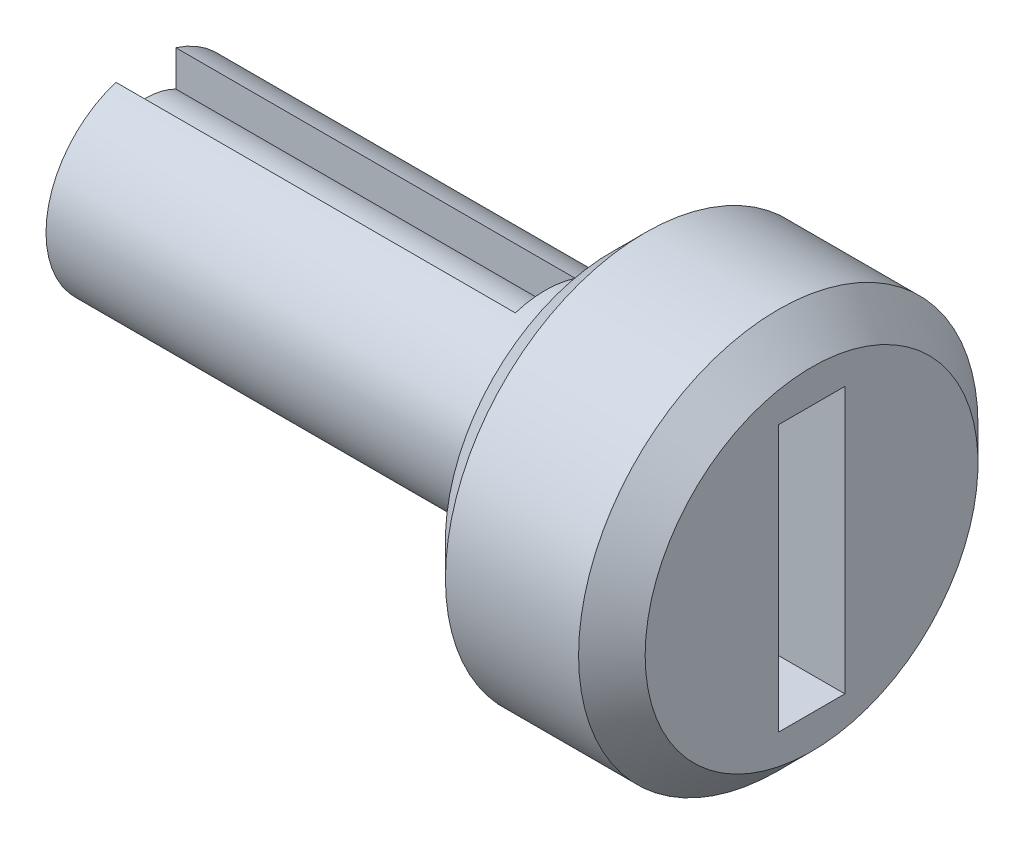
ISO-10303-21;
HEADER;
FILE_DESCRIPTION(('STEP AP214'),'2;1');
FILE_NAME('part.step','',(''),(''),'','','');
FILE_SCHEMA(('AUTOMOTIVE_DESIGN { 1 0 10303 214 1 1 1 1 }'));
ENDSEC;
DATA;
#1=APPLICATION_CONTEXT('core data for automotive mechanical design processes');
#2=APPLICATION_PROTOCOL_DEFINITION('international standard','automotive_design',2000,#1);
#3=PRODUCT_CONTEXT('',#1,'mechanical');
#4=PRODUCT('Part','Part','',(#3));
#5=PRODUCT_RELATED_PRODUCT_CATEGORY('part','',(#4));
#6=PRODUCT_DEFINITION_FORMATION('','',#4);
#7=PRODUCT_DEFINITION_CONTEXT('part definition',#1,'design');
#8=PRODUCT_DEFINITION('design','',#6,#7);
#9=PRODUCT_DEFINITION_SHAPE('','',#8);
#10=(LENGTH_UNIT() NAMED_UNIT(*) SI_UNIT(.MILLI.,.METRE.));
#11=(NAMED_UNIT(*) PLANE_ANGLE_UNIT() SI_UNIT($,.RADIAN.));
#12=(NAMED_UNIT(*) SI_UNIT($,.STERADIAN.) SOLID_ANGLE_UNIT());
#13=UNCERTAINTY_MEASURE_WITH_UNIT(LENGTH_MEASURE(1.E-05),#10,'distance_accuracy_value','');
#14=(GEOMETRIC_REPRESENTATION_CONTEXT(3) GLOBAL_UNCERTAINTY_ASSIGNED_CONTEXT((#13)) GLOBAL_UNIT_ASSIGNED_CONTEXT((#10,
#11,#12)) REPRESENTATION_CONTEXT('',''));
#15=CARTESIAN_POINT('',(0.,0.,0.));
#16=DIRECTION('',(0.,0.,1.));
#17=DIRECTION('',(1.,0.,0.));
#18=AXIS2_PLACEMENT_3D('',#15,#16,#17);
#19=CARTESIAN_POINT('',(0.,0.,0.));
#20=DIRECTION('',(1.,0.,0.));
#21=DIRECTION('',(0.,0.,-1.));
#22=AXIS2_PLACEMENT_3D('',#19,#20,#21);
#23=PLANE('',#22);
#24=CARTESIAN_POINT('',(0.,0.,0.));
#25=DIRECTION('',(-1.,0.,0.));
#26=DIRECTION('',(0.,0.,1.));
#27=AXIS2_PLACEMENT_3D('',#24,#25,#26);
#28=CIRCLE('',#27,1.2);
#29=CARTESIAN_POINT('',(0.,0.,1.2));
#30=VERTEX_POINT('',#29);
#31=EDGE_CURVE('E216',#30,#30,#28,.T.);
#32=ORIENTED_EDGE('',*,*,#31,.F.);
#33=EDGE_LOOP('',(#32));
#34=FACE_BOUND('',#33,.T.);
#35=CARTESIAN_POINT('',(0.,0.,0.));
#36=DIRECTION('',(1.,0.,0.));
#37=DIRECTION('',(0.,0.,1.));
#38=AXIS2_PLACEMENT_3D('',#35,#36,#37);
#39=CIRCLE('',#38,2.);
#40=CARTESIAN_POINT('',(0.,-1.78605710994917,0.9));
#41=VERTEX_POINT('',#40);
#42=CARTESIAN_POINT('',(0.,-1.78605710994917,-0.9));
#43=VERTEX_POINT('',#42);
#44=EDGE_CURVE('E148',#41,#43,#39,.T.);
#45=ORIENTED_EDGE('',*,*,#44,.F.);
#46=DIRECTION('',(0.,1.,0.));
#47=VECTOR('',#46,1.);
#48=CARTESIAN_POINT('',(0.,-1.78605710994917,0.9));
#49=LINE('',#48,#47);
#50=CARTESIAN_POINT('',(0.,-2.86181760425084,0.9));
#51=VERTEX_POINT('',#50);
#52=EDGE_CURVE('E140',#51,#41,#49,.T.);
#53=ORIENTED_EDGE('',*,*,#52,.F.);
#54=CARTESIAN_POINT('',(0.,0.,0.));
#55=DIRECTION('',(-1.,0.,0.));
#56=DIRECTION('',(0.,0.,1.));
#57=AXIS2_PLACEMENT_3D('',#54,#55,#56);
#58=CIRCLE('',#57,3.);
#59=CARTESIAN_POINT('',(0.,2.86181760425084,0.9));
#60=VERTEX_POINT('',#59);
#61=EDGE_CURVE('E57',#51,#60,#58,.T.);
#62=ORIENTED_EDGE('',*,*,#61,.T.);
#63=DIRECTION('',(0.,1.,0.));
#64=VECTOR('',#63,1.);
#65=CARTESIAN_POINT('',(0.,2.86181760425084,0.9));
#66=LINE('',#65,#64);
#67=CARTESIAN_POINT('',(0.,1.78605710994917,0.9));
#68=VERTEX_POINT('',#67);
#69=EDGE_CURVE('E162',#68,#60,#66,.T.);
#70=ORIENTED_EDGE('',*,*,#69,.F.);
#71=CARTESIAN_POINT('',(0.,0.,0.));
#72=DIRECTION('',(1.,0.,0.));
#73=DIRECTION('',(0.,0.,1.));
#74=AXIS2_PLACEMENT_3D('',#71,#72,#73);
#75=CIRCLE('',#74,2.);
#76=CARTESIAN_POINT('',(0.,1.78605710994917,-0.9));
#77=VERTEX_POINT('',#76);
#78=EDGE_CURVE('E165',#77,#68,#75,.T.);
#79=ORIENTED_EDGE('',*,*,#78,.F.);
#80=DIRECTION('',(0.,-1.,0.));
#81=VECTOR('',#80,1.);
#82=CARTESIAN_POINT('',(0.,2.86181760425084,-0.9));
#83=LINE('',#82,#81);
#84=CARTESIAN_POINT('',(0.,2.86181760425084,-0.9));
#85=VERTEX_POINT('',#84);
#86=EDGE_CURVE('E161',#85,#77,#83,.T.);
#87=ORIENTED_EDGE('',*,*,#86,.F.);
#88=CARTESIAN_POINT('',(0.,-2.86181760425084,-0.9));
#89=VERTEX_POINT('',#88);
#90=EDGE_CURVE('E231',#85,#89,#58,.T.);
#91=ORIENTED_EDGE('',*,*,#90,.T.);
#92=DIRECTION('',(0.,-1.,0.));
#93=VECTOR('',#92,1.);
#94=CARTESIAN_POINT('',(0.,-1.78605710994917,-0.9));
#95=LINE('',#94,#93);
#96=EDGE_CURVE('E49',#43,#89,#95,.T.);
#97=ORIENTED_EDGE('',*,*,#96,.F.);
#98=EDGE_LOOP('',(#45,#53,#62,#70,#79,#87,#91,#97));
#99=FACE_BOUND('',#98,.T.);
#100=ADVANCED_FACE('F34',(#34,#99),#23,.F.);
#101=CARTESIAN_POINT('',(0.,0.,0.));
#102=DIRECTION('',(-1.,0.,0.));
#103=DIRECTION('',(0.,0.,1.));
#104=AXIS2_PLACEMENT_3D('',#101,#102,#103);
#105=CYLINDRICAL_SURFACE('',#104,3.);
#106=ORIENTED_EDGE('',*,*,#61,.F.);
#107=DIRECTION('',(-1.,0.,0.));
#108=VECTOR('',#107,1.);
#109=CARTESIAN_POINT('',(16.171095884641,-2.86181760425084,0.900000000000001));
#110=LINE('',#109,#108);
#111=CARTESIAN_POINT('',(12.,-2.86181760425084,0.9));
#112=VERTEX_POINT('',#111);
#113=EDGE_CURVE('E154',#112,#51,#110,.T.);
#114=ORIENTED_EDGE('',*,*,#113,.F.);
#115=CARTESIAN_POINT('',(12.,0.,0.));
#116=DIRECTION('',(1.,0.,0.));
#117=DIRECTION('',(0.,0.,-1.));
#118=AXIS2_PLACEMENT_3D('',#115,#116,#117);
#119=CIRCLE('',#118,3.);
#120=CARTESIAN_POINT('',(12.,-2.86181760425084,-0.9));
#121=VERTEX_POINT('',#120);
#122=EDGE_CURVE('E145',#121,#112,#119,.F.);
#123=ORIENTED_EDGE('',*,*,#122,.F.);
#124=DIRECTION('',(-1.,0.,0.));
#125=VECTOR('',#124,1.);
#126=CARTESIAN_POINT('',(16.171095884641,-2.86181760425084,-0.899999999999999));
#127=LINE('',#126,#125);
#128=EDGE_CURVE('E155',#121,#89,#127,.T.);
#129=ORIENTED_EDGE('',*,*,#128,.T.);
#130=ORIENTED_EDGE('',*,*,#90,.F.);
#131=DIRECTION('',(-1.,0.,0.));
#132=VECTOR('',#131,1.);
#133=CARTESIAN_POINT('',(16.171095884641,2.86181760425084,-0.899999999999999));
#134=LINE('',#133,#132);
#135=CARTESIAN_POINT('',(12.,2.86181760425084,-0.899999999999999));
#136=VERTEX_POINT('',#135);
#137=EDGE_CURVE('E176',#136,#85,#134,.T.);
#138=ORIENTED_EDGE('',*,*,#137,.F.);
#139=CARTESIAN_POINT('',(12.,0.,0.));
#140=DIRECTION('',(1.,0.,0.));
#141=DIRECTION('',(0.,0.,-1.));
#142=AXIS2_PLACEMENT_3D('',#139,#140,#141);
#143=CIRCLE('',#142,3.);
#144=CARTESIAN_POINT('',(12.,2.86181760425084,0.9));
#145=VERTEX_POINT('',#144);
#146=EDGE_CURVE('E173',#145,#136,#143,.F.);
#147=ORIENTED_EDGE('',*,*,#146,.F.);
#148=DIRECTION('',(-1.,0.,0.));
#149=VECTOR('',#148,1.);
#150=CARTESIAN_POINT('',(16.171095884641,2.86181760425084,0.900000000000001));
#151=LINE('',#150,#149);
#152=EDGE_CURVE('E177',#145,#60,#151,.T.);
#153=ORIENTED_EDGE('',*,*,#152,.T.);
#154=EDGE_LOOP('',(#106,#114,#123,#129,#130,#138,#147,#153));
#155=FACE_BOUND('',#154,.T.);
#156=CARTESIAN_POINT('',(14.,0.,0.));
#157=DIRECTION('',(-1.,0.,0.));
#158=DIRECTION('',(0.,0.,1.));
#159=AXIS2_PLACEMENT_3D('',#156,#157,#158);
#160=CIRCLE('',#159,3.);
#161=CARTESIAN_POINT('',(14.,0.,3.));
#162=VERTEX_POINT('',#161);
#163=EDGE_CURVE('E228',#162,#162,#160,.T.);
#164=ORIENTED_EDGE('',*,*,#163,.T.);
#165=EDGE_LOOP('',(#164));
#166=FACE_BOUND('',#165,.T.);
#167=ADVANCED_FACE('F265',(#155,#166),#105,.T.);
#168=CARTESIAN_POINT('',(14.,0.,-3.));
#169=DIRECTION('',(1.,0.,0.));
#170=DIRECTION('',(0.,0.,-1.));
#171=AXIS2_PLACEMENT_3D('',#168,#169,#170);
#172=PLANE('',#171);
#173=CARTESIAN_POINT('',(14.,0.,0.));
#174=DIRECTION('',(1.,0.,0.));
#175=DIRECTION('',(0.,0.,-1.));
#176=AXIS2_PLACEMENT_3D('',#173,#174,#175);
#177=CIRCLE('',#176,5.00000000000002);
#178=CARTESIAN_POINT('',(14.,0.,-5.00000000000001));
#179=VERTEX_POINT('',#178);
#180=EDGE_CURVE('E13',#179,#179,#177,.F.);
#181=ORIENTED_EDGE('',*,*,#180,.T.);
#182=EDGE_LOOP('',(#181));
#183=FACE_BOUND('',#182,.T.);
#184=ORIENTED_EDGE('',*,*,#163,.F.);
#185=EDGE_LOOP('',(#184));
#186=FACE_BOUND('',#185,.T.);
#187=ADVANCED_FACE('F254',(#183,#186),#172,.F.);
#188=CARTESIAN_POINT('',(0.,0.,0.));
#189=DIRECTION('',(-1.,0.,0.));
#190=DIRECTION('',(0.,0.,1.));
#191=AXIS2_PLACEMENT_3D('',#188,#189,#190);
#192=CYLINDRICAL_SURFACE('',#191,6.);
#193=CARTESIAN_POINT('',(19.,0.,0.));
#194=DIRECTION('',(-1.,0.,0.));
#195=DIRECTION('',(0.,0.,1.));
#196=AXIS2_PLACEMENT_3D('',#193,#194,#195);
#197=CIRCLE('',#196,6.);
#198=CARTESIAN_POINT('',(19.,0.,6.));
#199=VERTEX_POINT('',#198);
#200=EDGE_CURVE('E237',#199,#199,#197,.T.);
#201=ORIENTED_EDGE('',*,*,#200,.T.);
#202=EDGE_LOOP('',(#201));
#203=FACE_BOUND('',#202,.T.);
#204=CARTESIAN_POINT('',(15.,0.,0.));
#205=DIRECTION('',(1.,0.,0.));
#206=DIRECTION('',(0.,0.,-1.));
#207=AXIS2_PLACEMENT_3D('',#204,#205,#206);
#208=CIRCLE('',#207,6.);
#209=CARTESIAN_POINT('',(15.,0.,-6.));
#210=VERTEX_POINT('',#209);
#211=EDGE_CURVE('E234',#210,#210,#208,.T.);
#212=ORIENTED_EDGE('',*,*,#211,.T.);
#213=EDGE_LOOP('',(#212));
#214=FACE_BOUND('',#213,.T.);
#215=ADVANCED_FACE('F251',(#203,#214),#192,.T.);
#216=CARTESIAN_POINT('',(20.,0.,-6.));
#217=DIRECTION('',(-1.,0.,0.));
#218=DIRECTION('',(0.,0.,1.));
#219=AXIS2_PLACEMENT_3D('',#216,#217,#218);
#220=PLANE('',#219);
#221=CARTESIAN_POINT('',(20.,0.,0.));
#222=DIRECTION('',(-1.,0.,0.));
#223=DIRECTION('',(0.,0.,1.));
#224=AXIS2_PLACEMENT_3D('',#221,#222,#223);
#225=CIRCLE('',#224,5.);
#226=CARTESIAN_POINT('',(20.,0.,5.));
#227=VERTEX_POINT('',#226);
#228=EDGE_CURVE('E42',#227,#227,#225,.F.);
#229=ORIENTED_EDGE('',*,*,#228,.T.);
#230=EDGE_LOOP('',(#229));
#231=FACE_BOUND('',#230,.T.);
#232=DIRECTION('',(0.,0.,1.));
#233=VECTOR('',#232,1.);
#234=CARTESIAN_POINT('',(20.,4.,1.));
#235=LINE('',#234,#233);
#236=CARTESIAN_POINT('',(20.,4.,-0.999999999999999));
#237=VERTEX_POINT('',#236);
#238=CARTESIAN_POINT('',(20.,4.,1.));
#239=VERTEX_POINT('',#238);
#240=EDGE_CURVE('E206',#237,#239,#235,.T.);
#241=ORIENTED_EDGE('',*,*,#240,.F.);
#242=DIRECTION('',(0.,1.,0.));
#243=VECTOR('',#242,1.);
#244=CARTESIAN_POINT('',(20.,-4.,-0.999999999999999));
#245=LINE('',#244,#243);
#246=CARTESIAN_POINT('',(20.,-4.,-0.999999999999999));
#247=VERTEX_POINT('',#246);
#248=EDGE_CURVE('E190',#247,#237,#245,.T.);
#249=ORIENTED_EDGE('',*,*,#248,.F.);
#250=DIRECTION('',(0.,0.,-1.));
#251=VECTOR('',#250,1.);
#252=CARTESIAN_POINT('',(20.,-4.,1.));
#253=LINE('',#252,#251);
#254=CARTESIAN_POINT('',(20.,-4.,1.));
#255=VERTEX_POINT('',#254);
#256=EDGE_CURVE('E195',#255,#247,#253,.T.);
#257=ORIENTED_EDGE('',*,*,#256,.F.);
#258=DIRECTION('',(0.,-1.,0.));
#259=VECTOR('',#258,1.);
#260=CARTESIAN_POINT('',(20.,-4.,1.));
#261=LINE('',#260,#259);
#262=EDGE_CURVE('E209',#239,#255,#261,.T.);
#263=ORIENTED_EDGE('',*,*,#262,.F.);
#264=EDGE_LOOP('',(#241,#249,#257,#263));
#265=FACE_BOUND('',#264,.T.);
#266=ADVANCED_FACE('F242',(#231,#265),#220,.F.);
#267=CARTESIAN_POINT('',(14.,0.,-3.));
#268=DIRECTION('',(1.,0.,0.));
#269=DIRECTION('',(0.,0.,-1.));
#270=AXIS2_PLACEMENT_3D('',#267,#268,#269);
#271=PLANE('',#270);
#272=CARTESIAN_POINT('',(14.,0.,0.));
#273=DIRECTION('',(1.,0.,0.));
#274=DIRECTION('',(0.,0.,-1.));
#275=AXIS2_PLACEMENT_3D('',#272,#273,#274);
#276=CIRCLE('',#275,1.2);
#277=CARTESIAN_POINT('',(14.,0.,-1.2));
#278=VERTEX_POINT('',#277);
#279=EDGE_CURVE('E225',#278,#278,#276,.F.);
#280=ORIENTED_EDGE('',*,*,#279,.T.);
#281=EDGE_LOOP('',(#280));
#282=FACE_BOUND('',#281,.T.);
#283=ADVANCED_FACE('F280',(#282),#271,.F.);
#284=CARTESIAN_POINT('',(17.3941125496954,0.,0.));
#285=DIRECTION('',(-1.,0.,0.));
#286=DIRECTION('',(0.,0.,1.));
#287=AXIS2_PLACEMENT_3D('',#284,#285,#286);
#288=CYLINDRICAL_SURFACE('',#287,1.2);
#289=ORIENTED_EDGE('',*,*,#31,.T.);
#290=EDGE_LOOP('',(#289));
#291=FACE_BOUND('',#290,.T.);
#292=ORIENTED_EDGE('',*,*,#279,.F.);
#293=EDGE_LOOP('',(#292));
#294=FACE_BOUND('',#293,.T.);
#295=ADVANCED_FACE('F283',(#291,#294),#288,.F.);
#296=CARTESIAN_POINT('',(16.,-4.,-0.999999999999999));
#297=DIRECTION('',(0.,0.,-1.));
#298=DIRECTION('',(-1.,0.,0.));
#299=AXIS2_PLACEMENT_3D('',#296,#297,#298);
#300=PLANE('',#299);
#301=ORIENTED_EDGE('',*,*,#248,.T.);
#302=DIRECTION('',(1.,0.,0.));
#303=VECTOR('',#302,1.);
#304=CARTESIAN_POINT('',(16.,4.,-0.999999999999999));
#305=LINE('',#304,#303);
#306=CARTESIAN_POINT('',(16.,4.,-0.999999999999999));
#307=VERTEX_POINT('',#306);
#308=EDGE_CURVE('E204',#307,#237,#305,.T.);
#309=ORIENTED_EDGE('',*,*,#308,.F.);
#310=DIRECTION('',(0.,1.,0.));
#311=VECTOR('',#310,1.);
#312=CARTESIAN_POINT('',(16.,-4.,-0.999999999999999));
#313=LINE('',#312,#311);
#314=CARTESIAN_POINT('',(16.,-4.,-0.999999999999999));
#315=VERTEX_POINT('',#314);
#316=EDGE_CURVE('E191',#315,#307,#313,.T.);
#317=ORIENTED_EDGE('',*,*,#316,.F.);
#318=DIRECTION('',(1.,0.,0.));
#319=VECTOR('',#318,1.);
#320=CARTESIAN_POINT('',(16.,-4.,-0.999999999999999));
#321=LINE('',#320,#319);
#322=EDGE_CURVE('E214',#315,#247,#321,.T.);
#323=ORIENTED_EDGE('',*,*,#322,.T.);
#324=EDGE_LOOP('',(#301,#309,#317,#323));
#325=FACE_BOUND('',#324,.T.);
#326=ADVANCED_FACE('F287',(#325),#300,.F.);
#327=CARTESIAN_POINT('',(16.,-4.,1.));
#328=DIRECTION('',(0.,-1.,0.));
#329=DIRECTION('',(0.,0.,-1.));
#330=AXIS2_PLACEMENT_3D('',#327,#328,#329);
#331=PLANE('',#330);
#332=ORIENTED_EDGE('',*,*,#256,.T.);
#333=ORIENTED_EDGE('',*,*,#322,.F.);
#334=DIRECTION('',(0.,0.,-1.));
#335=VECTOR('',#334,1.);
#336=CARTESIAN_POINT('',(16.,-4.,1.));
#337=LINE('',#336,#335);
#338=CARTESIAN_POINT('',(16.,-4.,1.));
#339=VERTEX_POINT('',#338);
#340=EDGE_CURVE('E201',#339,#315,#337,.T.);
#341=ORIENTED_EDGE('',*,*,#340,.F.);
#342=DIRECTION('',(1.,0.,0.));
#343=VECTOR('',#342,1.);
#344=CARTESIAN_POINT('',(16.,-4.,1.));
#345=LINE('',#344,#343);
#346=EDGE_CURVE('E217',#339,#255,#345,.T.);
#347=ORIENTED_EDGE('',*,*,#346,.T.);
#348=EDGE_LOOP('',(#332,#333,#341,#347));
#349=FACE_BOUND('',#348,.T.);
#350=ADVANCED_FACE('F291',(#349),#331,.F.);
#351=CARTESIAN_POINT('',(16.,-4.,1.));
#352=DIRECTION('',(0.,0.,1.));
#353=DIRECTION('',(1.,0.,0.));
#354=AXIS2_PLACEMENT_3D('',#351,#352,#353);
#355=PLANE('',#354);
#356=ORIENTED_EDGE('',*,*,#262,.T.);
#357=ORIENTED_EDGE('',*,*,#346,.F.);
#358=DIRECTION('',(0.,-1.,0.));
#359=VECTOR('',#358,1.);
#360=CARTESIAN_POINT('',(16.,-4.,1.));
#361=LINE('',#360,#359);
#362=CARTESIAN_POINT('',(16.,4.,1.));
#363=VERTEX_POINT('',#362);
#364=EDGE_CURVE('E198',#363,#339,#361,.T.);
#365=ORIENTED_EDGE('',*,*,#364,.F.);
#366=DIRECTION('',(1.,0.,0.));
#367=VECTOR('',#366,1.);
#368=CARTESIAN_POINT('',(16.,4.,1.));
#369=LINE('',#368,#367);
#370=EDGE_CURVE('E219',#363,#239,#369,.T.);
#371=ORIENTED_EDGE('',*,*,#370,.T.);
#372=EDGE_LOOP('',(#356,#357,#365,#371));
#373=FACE_BOUND('',#372,.T.);
#374=ADVANCED_FACE('F296',(#373),#355,.F.);
#375=CARTESIAN_POINT('',(16.,4.,1.));
#376=DIRECTION('',(0.,1.,0.));
#377=DIRECTION('',(0.,0.,1.));
#378=AXIS2_PLACEMENT_3D('',#375,#376,#377);
#379=PLANE('',#378);
#380=ORIENTED_EDGE('',*,*,#240,.T.);
#381=ORIENTED_EDGE('',*,*,#370,.F.);
#382=DIRECTION('',(0.,0.,1.));
#383=VECTOR('',#382,1.);
#384=CARTESIAN_POINT('',(16.,4.,1.));
#385=LINE('',#384,#383);
#386=EDGE_CURVE('E194',#307,#363,#385,.T.);
#387=ORIENTED_EDGE('',*,*,#386,.F.);
#388=ORIENTED_EDGE('',*,*,#308,.T.);
#389=EDGE_LOOP('',(#380,#381,#387,#388));
#390=FACE_BOUND('',#389,.T.);
#391=ADVANCED_FACE('F293',(#390),#379,.F.);
#392=CARTESIAN_POINT('',(16.,4.,-0.999999999999999));
#393=DIRECTION('',(-1.,0.,0.));
#394=DIRECTION('',(0.,0.,1.));
#395=AXIS2_PLACEMENT_3D('',#392,#393,#394);
#396=PLANE('',#395);
#397=ORIENTED_EDGE('',*,*,#316,.T.);
#398=ORIENTED_EDGE('',*,*,#386,.T.);
#399=ORIENTED_EDGE('',*,*,#364,.T.);
#400=ORIENTED_EDGE('',*,*,#340,.T.);
#401=EDGE_LOOP('',(#397,#398,#399,#400));
#402=FACE_BOUND('',#401,.T.);
#403=ADVANCED_FACE('F248',(#402),#396,.F.);
#404=CARTESIAN_POINT('',(19.,0.,0.));
#405=DIRECTION('',(-1.,0.,0.));
#406=DIRECTION('',(0.,0.,1.));
#407=AXIS2_PLACEMENT_3D('',#404,#405,#406);
#408=CONICAL_SURFACE('',#407,6.,0.785398163397451);
#409=ORIENTED_EDGE('',*,*,#228,.F.);
#410=EDGE_LOOP('',(#409));
#411=FACE_BOUND('',#410,.T.);
#412=ORIENTED_EDGE('',*,*,#200,.F.);
#413=EDGE_LOOP('',(#412));
#414=FACE_BOUND('',#413,.T.);
#415=ADVANCED_FACE('F245',(#411,#414),#408,.T.);
#416=CARTESIAN_POINT('',(14.,0.,0.));
#417=DIRECTION('',(1.,0.,0.));
#418=DIRECTION('',(0.,0.,-1.));
#419=AXIS2_PLACEMENT_3D('',#416,#417,#418);
#420=CONICAL_SURFACE('',#419,5.00000000000002,0.785398163397447);
#421=ORIENTED_EDGE('',*,*,#211,.F.);
#422=EDGE_LOOP('',(#421));
#423=FACE_BOUND('',#422,.T.);
#424=ORIENTED_EDGE('',*,*,#180,.F.);
#425=EDGE_LOOP('',(#424));
#426=FACE_BOUND('',#425,.T.);
#427=ADVANCED_FACE('F36',(#423,#426),#420,.T.);
#428=CARTESIAN_POINT('',(12.,0.,-3.));
#429=DIRECTION('',(1.,0.,0.));
#430=DIRECTION('',(0.,0.,-1.));
#431=AXIS2_PLACEMENT_3D('',#428,#429,#430);
#432=PLANE('',#431);
#433=ORIENTED_EDGE('',*,*,#146,.T.);
#434=DIRECTION('',(0.,-1.,0.));
#435=VECTOR('',#434,1.);
#436=CARTESIAN_POINT('',(12.,2.86181760425084,-0.899999999999999));
#437=LINE('',#436,#435);
#438=CARTESIAN_POINT('',(12.,1.78605710994917,-0.899999999999999));
#439=VERTEX_POINT('',#438);
#440=EDGE_CURVE('E164',#136,#439,#437,.T.);
#441=ORIENTED_EDGE('',*,*,#440,.T.);
#442=CARTESIAN_POINT('',(12.,0.,0.));
#443=DIRECTION('',(1.,0.,0.));
#444=DIRECTION('',(0.,0.,-1.));
#445=AXIS2_PLACEMENT_3D('',#442,#443,#444);
#446=CIRCLE('',#445,2.);
#447=CARTESIAN_POINT('',(12.,1.78605710994917,0.9));
#448=VERTEX_POINT('',#447);
#449=EDGE_CURVE('E182',#439,#448,#446,.T.);
#450=ORIENTED_EDGE('',*,*,#449,.T.);
#451=DIRECTION('',(0.,1.,0.));
#452=VECTOR('',#451,1.);
#453=CARTESIAN_POINT('',(12.,2.86181760425084,0.9));
#454=LINE('',#453,#452);
#455=EDGE_CURVE('E178',#448,#145,#454,.T.);
#456=ORIENTED_EDGE('',*,*,#455,.T.);
#457=EDGE_LOOP('',(#433,#441,#450,#456));
#458=FACE_BOUND('',#457,.T.);
#459=ADVANCED_FACE('F260',(#458),#432,.F.);
#460=CARTESIAN_POINT('',(16.171095884641,2.86181760425084,-0.899999999999999));
#461=DIRECTION('',(0.,0.,-1.));
#462=DIRECTION('',(-1.,0.,0.));
#463=AXIS2_PLACEMENT_3D('',#460,#461,#462);
#464=PLANE('',#463);
#465=ORIENTED_EDGE('',*,*,#137,.T.);
#466=ORIENTED_EDGE('',*,*,#86,.T.);
#467=DIRECTION('',(-1.,0.,0.));
#468=VECTOR('',#467,1.);
#469=CARTESIAN_POINT('',(16.171095884641,1.78605710994917,-0.899999999999999));
#470=LINE('',#469,#468);
#471=EDGE_CURVE('E172',#439,#77,#470,.T.);
#472=ORIENTED_EDGE('',*,*,#471,.F.);
#473=ORIENTED_EDGE('',*,*,#440,.F.);
#474=EDGE_LOOP('',(#465,#466,#472,#473));
#475=FACE_BOUND('',#474,.T.);
#476=ADVANCED_FACE('F309',(#475),#464,.F.);
#477=CARTESIAN_POINT('',(16.171095884641,0.,0.));
#478=DIRECTION('',(-1.,0.,0.));
#479=DIRECTION('',(0.,0.,1.));
#480=AXIS2_PLACEMENT_3D('',#477,#478,#479);
#481=CYLINDRICAL_SURFACE('',#480,2.);
#482=ORIENTED_EDGE('',*,*,#471,.T.);
#483=ORIENTED_EDGE('',*,*,#78,.T.);
#484=DIRECTION('',(-1.,0.,0.));
#485=VECTOR('',#484,1.);
#486=CARTESIAN_POINT('',(16.171095884641,1.78605710994917,0.9));
#487=LINE('',#486,#485);
#488=EDGE_CURVE('E181',#448,#68,#487,.T.);
#489=ORIENTED_EDGE('',*,*,#488,.F.);
#490=ORIENTED_EDGE('',*,*,#449,.F.);
#491=EDGE_LOOP('',(#482,#483,#489,#490));
#492=FACE_BOUND('',#491,.T.);
#493=ADVANCED_FACE('F313',(#492),#481,.T.);
#494=CARTESIAN_POINT('',(16.171095884641,2.86181760425084,0.900000000000001));
#495=DIRECTION('',(0.,0.,1.));
#496=DIRECTION('',(1.,0.,0.));
#497=AXIS2_PLACEMENT_3D('',#494,#495,#496);
#498=PLANE('',#497);
#499=ORIENTED_EDGE('',*,*,#488,.T.);
#500=ORIENTED_EDGE('',*,*,#69,.T.);
#501=ORIENTED_EDGE('',*,*,#152,.F.);
#502=ORIENTED_EDGE('',*,*,#455,.F.);
#503=EDGE_LOOP('',(#499,#500,#501,#502));
#504=FACE_BOUND('',#503,.T.);
#505=ADVANCED_FACE('F317',(#504),#498,.F.);
#506=CARTESIAN_POINT('',(12.,0.,-3.));
#507=DIRECTION('',(1.,0.,0.));
#508=DIRECTION('',(0.,0.,-1.));
#509=AXIS2_PLACEMENT_3D('',#506,#507,#508);
#510=PLANE('',#509);
#511=ORIENTED_EDGE('',*,*,#122,.T.);
#512=DIRECTION('',(0.,1.,0.));
#513=VECTOR('',#512,1.);
#514=CARTESIAN_POINT('',(12.,-1.78605710994917,0.900000000000001));
#515=LINE('',#514,#513);
#516=CARTESIAN_POINT('',(12.,-1.78605710994917,0.900000000000001));
#517=VERTEX_POINT('',#516);
#518=EDGE_CURVE('E138',#112,#517,#515,.T.);
#519=ORIENTED_EDGE('',*,*,#518,.T.);
#520=CARTESIAN_POINT('',(12.,0.,0.));
#521=DIRECTION('',(1.,0.,0.));
#522=DIRECTION('',(0.,0.,-1.));
#523=AXIS2_PLACEMENT_3D('',#520,#521,#522);
#524=CIRCLE('',#523,2.);
#525=CARTESIAN_POINT('',(12.,-1.78605710994917,-0.9));
#526=VERTEX_POINT('',#525);
#527=EDGE_CURVE('E125',#517,#526,#524,.T.);
#528=ORIENTED_EDGE('',*,*,#527,.T.);
#529=DIRECTION('',(0.,-1.,0.));
#530=VECTOR('',#529,1.);
#531=CARTESIAN_POINT('',(12.,-1.78605710994917,-0.9));
#532=LINE('',#531,#530);
#533=EDGE_CURVE('E156',#526,#121,#532,.T.);
#534=ORIENTED_EDGE('',*,*,#533,.T.);
#535=EDGE_LOOP('',(#511,#519,#528,#534));
#536=FACE_BOUND('',#535,.T.);
#537=ADVANCED_FACE('F143',(#536),#510,.F.);
#538=CARTESIAN_POINT('',(16.171095884641,-1.78605710994917,0.900000000000001));
#539=DIRECTION('',(0.,0.,1.));
#540=DIRECTION('',(0.,-1.,0.));
#541=AXIS2_PLACEMENT_3D('',#538,#539,#540);
#542=PLANE('',#541);
#543=ORIENTED_EDGE('',*,*,#113,.T.);
#544=ORIENTED_EDGE('',*,*,#52,.T.);
#545=DIRECTION('',(-1.,0.,0.));
#546=VECTOR('',#545,1.);
#547=CARTESIAN_POINT('',(16.171095884641,-1.78605710994917,0.900000000000001));
#548=LINE('',#547,#546);
#549=EDGE_CURVE('E129',#517,#41,#548,.T.);
#550=ORIENTED_EDGE('',*,*,#549,.F.);
#551=ORIENTED_EDGE('',*,*,#518,.F.);
#552=EDGE_LOOP('',(#543,#544,#550,#551));
#553=FACE_BOUND('',#552,.T.);
#554=ADVANCED_FACE('F137',(#553),#542,.F.);
#555=CARTESIAN_POINT('',(16.171095884641,0.,0.));
#556=DIRECTION('',(-1.,0.,0.));
#557=DIRECTION('',(0.,0.,1.));
#558=AXIS2_PLACEMENT_3D('',#555,#556,#557);
#559=CYLINDRICAL_SURFACE('',#558,2.);
#560=ORIENTED_EDGE('',*,*,#549,.T.);
#561=ORIENTED_EDGE('',*,*,#44,.T.);
#562=DIRECTION('',(-1.,0.,0.));
#563=VECTOR('',#562,1.);
#564=CARTESIAN_POINT('',(16.171095884641,-1.78605710994917,-0.9));
#565=LINE('',#564,#563);
#566=EDGE_CURVE('E131',#526,#43,#565,.T.);
#567=ORIENTED_EDGE('',*,*,#566,.F.);
#568=ORIENTED_EDGE('',*,*,#527,.F.);
#569=EDGE_LOOP('',(#560,#561,#567,#568));
#570=FACE_BOUND('',#569,.T.);
#571=ADVANCED_FACE('F127',(#570),#559,.T.);
#572=CARTESIAN_POINT('',(16.171095884641,-1.78605710994917,-0.899999999999999));
#573=DIRECTION('',(0.,0.,-1.));
#574=DIRECTION('',(-1.,0.,0.));
#575=AXIS2_PLACEMENT_3D('',#572,#573,#574);
#576=PLANE('',#575);
#577=ORIENTED_EDGE('',*,*,#566,.T.);
#578=ORIENTED_EDGE('',*,*,#96,.T.);
#579=ORIENTED_EDGE('',*,*,#128,.F.);
#580=ORIENTED_EDGE('',*,*,#533,.F.);
#581=EDGE_LOOP('',(#577,#578,#579,#580));
#582=FACE_BOUND('',#581,.T.);
#583=ADVANCED_FACE('F328',(#582),#576,.F.);
#584=CLOSED_SHELL('',(#100,#167,#187,#215,#266,#283,#295,#326,#350,#374,#391,#403,#415,#427,
#459,#476,#493,#505,#537,#554,#571,#583));
#585=MANIFOLD_SOLID_BREP('B2',#584);
#586=ADVANCED_BREP_SHAPE_REPRESENTATION('',(#18,#585),#14);
#587=SHAPE_DEFINITION_REPRESENTATION(#9,#586);
ENDSEC;
END-ISO-10303-21;
